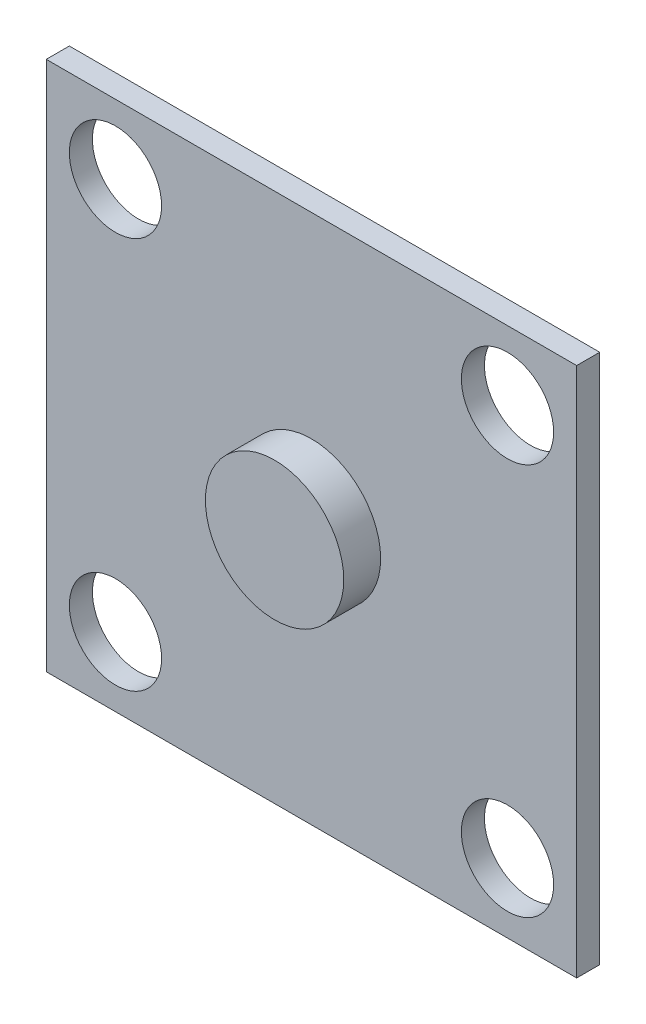
ISO-10303-21;
HEADER;
FILE_DESCRIPTION(('STEP AP214'),'2;1');
FILE_NAME('part.step','',(''),(''),'','','');
FILE_SCHEMA(('AUTOMOTIVE_DESIGN { 1 0 10303 214 1 1 1 1 }'));
ENDSEC;
DATA;
#1=APPLICATION_CONTEXT('core data for automotive mechanical design processes');
#2=APPLICATION_PROTOCOL_DEFINITION('international standard','automotive_design',2000,#1);
#3=PRODUCT_CONTEXT('',#1,'mechanical');
#4=PRODUCT('Part','Part','',(#3));
#5=PRODUCT_RELATED_PRODUCT_CATEGORY('part','',(#4));
#6=PRODUCT_DEFINITION_FORMATION('','',#4);
#7=PRODUCT_DEFINITION_CONTEXT('part definition',#1,'design');
#8=PRODUCT_DEFINITION('design','',#6,#7);
#9=PRODUCT_DEFINITION_SHAPE('','',#8);
#10=(LENGTH_UNIT() NAMED_UNIT(*) SI_UNIT(.MILLI.,.METRE.));
#11=(NAMED_UNIT(*) PLANE_ANGLE_UNIT() SI_UNIT($,.RADIAN.));
#12=(NAMED_UNIT(*) SI_UNIT($,.STERADIAN.) SOLID_ANGLE_UNIT());
#13=UNCERTAINTY_MEASURE_WITH_UNIT(LENGTH_MEASURE(1.E-05),#10,'distance_accuracy_value','');
#14=(GEOMETRIC_REPRESENTATION_CONTEXT(3) GLOBAL_UNCERTAINTY_ASSIGNED_CONTEXT((#13)) GLOBAL_UNIT_ASSIGNED_CONTEXT((#10,
#11,#12)) REPRESENTATION_CONTEXT('',''));
#15=CARTESIAN_POINT('',(0.,0.,0.));
#16=DIRECTION('',(0.,0.,1.));
#17=DIRECTION('',(1.,0.,0.));
#18=AXIS2_PLACEMENT_3D('',#15,#16,#17);
#19=CARTESIAN_POINT('',(0.,0.,1.));
#20=DIRECTION('',(0.,0.,1.));
#21=DIRECTION('',(1.,0.,0.));
#22=AXIS2_PLACEMENT_3D('',#19,#20,#21);
#23=PLANE('',#22);
#24=CARTESIAN_POINT('',(-3.27604166666667,5.62239583333333,1.));
#25=DIRECTION('',(0.,0.,1.));
#26=DIRECTION('',(1.,0.,0.));
#27=AXIS2_PLACEMENT_3D('',#24,#25,#26);
#28=CIRCLE('',#27,3.);
#29=CARTESIAN_POINT('',(-0.276041666666671,5.62239583333333,1.));
#30=VERTEX_POINT('',#29);
#31=EDGE_CURVE('E139',#30,#30,#28,.T.);
#32=ORIENTED_EDGE('',*,*,#31,.F.);
#33=EDGE_LOOP('',(#32));
#34=FACE_BOUND('',#33,.T.);
#35=CARTESIAN_POINT('',(5.22395833333333,-2.87760416666667,1.));
#36=DIRECTION('',(0.,0.,1.));
#37=DIRECTION('',(1.,0.,0.));
#38=AXIS2_PLACEMENT_3D('',#35,#36,#37);
#39=CIRCLE('',#38,2.);
#40=CARTESIAN_POINT('',(7.22395833333333,-2.87760416666667,1.));
#41=VERTEX_POINT('',#40);
#42=EDGE_CURVE('E124',#41,#41,#39,.T.);
#43=ORIENTED_EDGE('',*,*,#42,.F.);
#44=EDGE_LOOP('',(#43));
#45=FACE_BOUND('',#44,.T.);
#46=CARTESIAN_POINT('',(-11.7760416666667,14.1223958333333,1.));
#47=DIRECTION('',(0.,0.,1.));
#48=DIRECTION('',(1.,0.,0.));
#49=AXIS2_PLACEMENT_3D('',#46,#47,#48);
#50=CIRCLE('',#49,2.);
#51=CARTESIAN_POINT('',(-9.77604166666667,14.1223958333333,1.));
#52=VERTEX_POINT('',#51);
#53=EDGE_CURVE('E103',#52,#52,#50,.T.);
#54=ORIENTED_EDGE('',*,*,#53,.F.);
#55=EDGE_LOOP('',(#54));
#56=FACE_BOUND('',#55,.T.);
#57=DIRECTION('',(0.,1.,0.));
#58=VECTOR('',#57,1.);
#59=CARTESIAN_POINT('',(8.22395833333333,17.1223958333333,1.));
#60=LINE('',#59,#58);
#61=CARTESIAN_POINT('',(8.22395833333333,-5.87760416666667,1.));
#62=VERTEX_POINT('',#61);
#63=CARTESIAN_POINT('',(8.22395833333333,17.1223958333333,1.));
#64=VERTEX_POINT('',#63);
#65=EDGE_CURVE('E88',#62,#64,#60,.T.);
#66=ORIENTED_EDGE('',*,*,#65,.T.);
#67=DIRECTION('',(-1.,0.,0.));
#68=VECTOR('',#67,1.);
#69=CARTESIAN_POINT('',(-14.7760416666667,17.1223958333333,1.));
#70=LINE('',#69,#68);
#71=CARTESIAN_POINT('',(-14.7760416666667,17.1223958333333,1.));
#72=VERTEX_POINT('',#71);
#73=EDGE_CURVE('E83',#64,#72,#70,.T.);
#74=ORIENTED_EDGE('',*,*,#73,.T.);
#75=DIRECTION('',(0.,-1.,0.));
#76=VECTOR('',#75,1.);
#77=CARTESIAN_POINT('',(-14.7760416666667,17.1223958333333,1.));
#78=LINE('',#77,#76);
#79=CARTESIAN_POINT('',(-14.7760416666667,-5.87760416666667,1.));
#80=VERTEX_POINT('',#79);
#81=EDGE_CURVE('E86',#72,#80,#78,.T.);
#82=ORIENTED_EDGE('',*,*,#81,.T.);
#83=DIRECTION('',(1.,0.,0.));
#84=VECTOR('',#83,1.);
#85=CARTESIAN_POINT('',(-14.7760416666667,-5.87760416666667,1.));
#86=LINE('',#85,#84);
#87=EDGE_CURVE('E53',#80,#62,#86,.T.);
#88=ORIENTED_EDGE('',*,*,#87,.T.);
#89=EDGE_LOOP('',(#66,#74,#82,#88));
#90=FACE_BOUND('',#89,.T.);
#91=CARTESIAN_POINT('',(-11.7760416666667,-2.87760416666667,1.));
#92=DIRECTION('',(0.,0.,1.));
#93=DIRECTION('',(1.,0.,0.));
#94=AXIS2_PLACEMENT_3D('',#91,#92,#93);
#95=CIRCLE('',#94,2.);
#96=CARTESIAN_POINT('',(-9.77604166666667,-2.87760416666667,1.));
#97=VERTEX_POINT('',#96);
#98=EDGE_CURVE('E118',#97,#97,#95,.T.);
#99=ORIENTED_EDGE('',*,*,#98,.F.);
#100=EDGE_LOOP('',(#99));
#101=FACE_BOUND('',#100,.T.);
#102=CARTESIAN_POINT('',(5.22395833333333,14.1223958333333,1.));
#103=DIRECTION('',(0.,0.,1.));
#104=DIRECTION('',(1.,0.,0.));
#105=AXIS2_PLACEMENT_3D('',#102,#103,#104);
#106=CIRCLE('',#105,2.);
#107=CARTESIAN_POINT('',(7.22395833333333,14.1223958333333,1.));
#108=VERTEX_POINT('',#107);
#109=EDGE_CURVE('E130',#108,#108,#106,.T.);
#110=ORIENTED_EDGE('',*,*,#109,.F.);
#111=EDGE_LOOP('',(#110));
#112=FACE_BOUND('',#111,.T.);
#113=ADVANCED_FACE('F36',(#34,#45,#56,#90,#101,#112),#23,.T.);
#114=CARTESIAN_POINT('',(0.,0.,0.));
#115=DIRECTION('',(0.,0.,1.));
#116=DIRECTION('',(1.,0.,0.));
#117=AXIS2_PLACEMENT_3D('',#114,#115,#116);
#118=PLANE('',#117);
#119=DIRECTION('',(0.,1.,0.));
#120=VECTOR('',#119,1.);
#121=CARTESIAN_POINT('',(8.22395833333333,17.1223958333333,0.));
#122=LINE('',#121,#120);
#123=CARTESIAN_POINT('',(8.22395833333333,-5.87760416666667,0.));
#124=VERTEX_POINT('',#123);
#125=CARTESIAN_POINT('',(8.22395833333333,17.1223958333333,0.));
#126=VERTEX_POINT('',#125);
#127=EDGE_CURVE('E100',#124,#126,#122,.T.);
#128=ORIENTED_EDGE('',*,*,#127,.F.);
#129=DIRECTION('',(1.,0.,0.));
#130=VECTOR('',#129,1.);
#131=CARTESIAN_POINT('',(-14.7760416666667,-5.87760416666667,0.));
#132=LINE('',#131,#130);
#133=CARTESIAN_POINT('',(-14.7760416666667,-5.87760416666667,0.));
#134=VERTEX_POINT('',#133);
#135=EDGE_CURVE('E76',#134,#124,#132,.T.);
#136=ORIENTED_EDGE('',*,*,#135,.F.);
#137=DIRECTION('',(0.,-1.,0.));
#138=VECTOR('',#137,1.);
#139=CARTESIAN_POINT('',(-14.7760416666667,17.1223958333333,0.));
#140=LINE('',#139,#138);
#141=CARTESIAN_POINT('',(-14.7760416666667,17.1223958333333,0.));
#142=VERTEX_POINT('',#141);
#143=EDGE_CURVE('E70',#142,#134,#140,.T.);
#144=ORIENTED_EDGE('',*,*,#143,.F.);
#145=DIRECTION('',(-1.,0.,0.));
#146=VECTOR('',#145,1.);
#147=CARTESIAN_POINT('',(-14.7760416666667,17.1223958333333,0.));
#148=LINE('',#147,#146);
#149=EDGE_CURVE('E92',#126,#142,#148,.T.);
#150=ORIENTED_EDGE('',*,*,#149,.F.);
#151=EDGE_LOOP('',(#128,#136,#144,#150));
#152=FACE_BOUND('',#151,.T.);
#153=CARTESIAN_POINT('',(-11.7760416666667,14.1223958333333,0.));
#154=DIRECTION('',(0.,0.,1.));
#155=DIRECTION('',(1.,0.,0.));
#156=AXIS2_PLACEMENT_3D('',#153,#154,#155);
#157=CIRCLE('',#156,2.);
#158=CARTESIAN_POINT('',(-9.77604166666667,14.1223958333333,0.));
#159=VERTEX_POINT('',#158);
#160=EDGE_CURVE('E115',#159,#159,#157,.T.);
#161=ORIENTED_EDGE('',*,*,#160,.T.);
#162=EDGE_LOOP('',(#161));
#163=FACE_BOUND('',#162,.T.);
#164=CARTESIAN_POINT('',(-11.7760416666667,-2.87760416666667,0.));
#165=DIRECTION('',(0.,0.,1.));
#166=DIRECTION('',(1.,0.,0.));
#167=AXIS2_PLACEMENT_3D('',#164,#165,#166);
#168=CIRCLE('',#167,2.);
#169=CARTESIAN_POINT('',(-9.77604166666667,-2.87760416666667,0.));
#170=VERTEX_POINT('',#169);
#171=EDGE_CURVE('E121',#170,#170,#168,.T.);
#172=ORIENTED_EDGE('',*,*,#171,.T.);
#173=EDGE_LOOP('',(#172));
#174=FACE_BOUND('',#173,.T.);
#175=CARTESIAN_POINT('',(5.22395833333333,-2.87760416666667,0.));
#176=DIRECTION('',(0.,0.,1.));
#177=DIRECTION('',(1.,0.,0.));
#178=AXIS2_PLACEMENT_3D('',#175,#176,#177);
#179=CIRCLE('',#178,2.);
#180=CARTESIAN_POINT('',(7.22395833333333,-2.87760416666667,0.));
#181=VERTEX_POINT('',#180);
#182=EDGE_CURVE('E127',#181,#181,#179,.T.);
#183=ORIENTED_EDGE('',*,*,#182,.T.);
#184=EDGE_LOOP('',(#183));
#185=FACE_BOUND('',#184,.T.);
#186=CARTESIAN_POINT('',(5.22395833333333,14.1223958333333,0.));
#187=DIRECTION('',(0.,0.,1.));
#188=DIRECTION('',(1.,0.,0.));
#189=AXIS2_PLACEMENT_3D('',#186,#187,#188);
#190=CIRCLE('',#189,2.);
#191=CARTESIAN_POINT('',(7.22395833333333,14.1223958333333,0.));
#192=VERTEX_POINT('',#191);
#193=EDGE_CURVE('E133',#192,#192,#190,.T.);
#194=ORIENTED_EDGE('',*,*,#193,.T.);
#195=EDGE_LOOP('',(#194));
#196=FACE_BOUND('',#195,.T.);
#197=ADVANCED_FACE('F111',(#152,#163,#174,#185,#196),#118,.F.);
#198=CARTESIAN_POINT('',(8.22395833333333,17.1223958333333,1.));
#199=DIRECTION('',(-1.,0.,0.));
#200=DIRECTION('',(0.,-1.,0.));
#201=AXIS2_PLACEMENT_3D('',#198,#199,#200);
#202=PLANE('',#201);
#203=ORIENTED_EDGE('',*,*,#127,.T.);
#204=DIRECTION('',(0.,0.,-1.));
#205=VECTOR('',#204,1.);
#206=CARTESIAN_POINT('',(8.22395833333333,17.1223958333333,1.));
#207=LINE('',#206,#205);
#208=EDGE_CURVE('E11',#64,#126,#207,.T.);
#209=ORIENTED_EDGE('',*,*,#208,.F.);
#210=ORIENTED_EDGE('',*,*,#65,.F.);
#211=DIRECTION('',(0.,0.,-1.));
#212=VECTOR('',#211,1.);
#213=CARTESIAN_POINT('',(8.22395833333333,-5.87760416666667,1.));
#214=LINE('',#213,#212);
#215=EDGE_CURVE('E96',#62,#124,#214,.T.);
#216=ORIENTED_EDGE('',*,*,#215,.T.);
#217=EDGE_LOOP('',(#203,#209,#210,#216));
#218=FACE_BOUND('',#217,.T.);
#219=ADVANCED_FACE('F38',(#218),#202,.F.);
#220=CARTESIAN_POINT('',(-14.7760416666667,17.1223958333333,1.));
#221=DIRECTION('',(0.,-1.,0.));
#222=DIRECTION('',(0.,0.,-1.));
#223=AXIS2_PLACEMENT_3D('',#220,#221,#222);
#224=PLANE('',#223);
#225=ORIENTED_EDGE('',*,*,#149,.T.);
#226=DIRECTION('',(0.,0.,-1.));
#227=VECTOR('',#226,1.);
#228=CARTESIAN_POINT('',(-14.7760416666667,17.1223958333333,1.));
#229=LINE('',#228,#227);
#230=EDGE_CURVE('E45',#72,#142,#229,.T.);
#231=ORIENTED_EDGE('',*,*,#230,.F.);
#232=ORIENTED_EDGE('',*,*,#73,.F.);
#233=ORIENTED_EDGE('',*,*,#208,.T.);
#234=EDGE_LOOP('',(#225,#231,#232,#233));
#235=FACE_BOUND('',#234,.T.);
#236=ADVANCED_FACE('F91',(#235),#224,.F.);
#237=CARTESIAN_POINT('',(-14.7760416666667,17.1223958333333,1.));
#238=DIRECTION('',(1.,0.,0.));
#239=DIRECTION('',(0.,1.,0.));
#240=AXIS2_PLACEMENT_3D('',#237,#238,#239);
#241=PLANE('',#240);
#242=ORIENTED_EDGE('',*,*,#143,.T.);
#243=DIRECTION('',(0.,0.,-1.));
#244=VECTOR('',#243,1.);
#245=CARTESIAN_POINT('',(-14.7760416666667,-5.87760416666667,1.));
#246=LINE('',#245,#244);
#247=EDGE_CURVE('E93',#80,#134,#246,.T.);
#248=ORIENTED_EDGE('',*,*,#247,.F.);
#249=ORIENTED_EDGE('',*,*,#81,.F.);
#250=ORIENTED_EDGE('',*,*,#230,.T.);
#251=EDGE_LOOP('',(#242,#248,#249,#250));
#252=FACE_BOUND('',#251,.T.);
#253=ADVANCED_FACE('F94',(#252),#241,.F.);
#254=CARTESIAN_POINT('',(-14.7760416666667,-5.87760416666667,1.));
#255=DIRECTION('',(0.,1.,0.));
#256=DIRECTION('',(-1.,0.,0.));
#257=AXIS2_PLACEMENT_3D('',#254,#255,#256);
#258=PLANE('',#257);
#259=ORIENTED_EDGE('',*,*,#135,.T.);
#260=ORIENTED_EDGE('',*,*,#215,.F.);
#261=ORIENTED_EDGE('',*,*,#87,.F.);
#262=ORIENTED_EDGE('',*,*,#247,.T.);
#263=EDGE_LOOP('',(#259,#260,#261,#262));
#264=FACE_BOUND('',#263,.T.);
#265=ADVANCED_FACE('F108',(#264),#258,.F.);
#266=CARTESIAN_POINT('',(-11.7760416666667,14.1223958333333,1.));
#267=DIRECTION('',(0.,0.,-1.));
#268=DIRECTION('',(-1.,0.,0.));
#269=AXIS2_PLACEMENT_3D('',#266,#267,#268);
#270=CYLINDRICAL_SURFACE('',#269,2.);
#271=ORIENTED_EDGE('',*,*,#53,.T.);
#272=EDGE_LOOP('',(#271));
#273=FACE_BOUND('',#272,.T.);
#274=ORIENTED_EDGE('',*,*,#160,.F.);
#275=EDGE_LOOP('',(#274));
#276=FACE_BOUND('',#275,.T.);
#277=ADVANCED_FACE('F161',(#273,#276),#270,.F.);
#278=CARTESIAN_POINT('',(-11.7760416666667,-2.87760416666667,1.));
#279=DIRECTION('',(0.,0.,-1.));
#280=DIRECTION('',(-1.,0.,0.));
#281=AXIS2_PLACEMENT_3D('',#278,#279,#280);
#282=CYLINDRICAL_SURFACE('',#281,2.);
#283=ORIENTED_EDGE('',*,*,#98,.T.);
#284=EDGE_LOOP('',(#283));
#285=FACE_BOUND('',#284,.T.);
#286=ORIENTED_EDGE('',*,*,#171,.F.);
#287=EDGE_LOOP('',(#286));
#288=FACE_BOUND('',#287,.T.);
#289=ADVANCED_FACE('F164',(#285,#288),#282,.F.);
#290=CARTESIAN_POINT('',(5.22395833333333,-2.87760416666667,1.));
#291=DIRECTION('',(0.,0.,-1.));
#292=DIRECTION('',(-1.,0.,0.));
#293=AXIS2_PLACEMENT_3D('',#290,#291,#292);
#294=CYLINDRICAL_SURFACE('',#293,2.);
#295=ORIENTED_EDGE('',*,*,#42,.T.);
#296=EDGE_LOOP('',(#295));
#297=FACE_BOUND('',#296,.T.);
#298=ORIENTED_EDGE('',*,*,#182,.F.);
#299=EDGE_LOOP('',(#298));
#300=FACE_BOUND('',#299,.T.);
#301=ADVANCED_FACE('F177',(#297,#300),#294,.F.);
#302=CARTESIAN_POINT('',(5.22395833333333,14.1223958333333,1.));
#303=DIRECTION('',(0.,0.,-1.));
#304=DIRECTION('',(-1.,0.,0.));
#305=AXIS2_PLACEMENT_3D('',#302,#303,#304);
#306=CYLINDRICAL_SURFACE('',#305,2.);
#307=ORIENTED_EDGE('',*,*,#109,.T.);
#308=EDGE_LOOP('',(#307));
#309=FACE_BOUND('',#308,.T.);
#310=ORIENTED_EDGE('',*,*,#193,.F.);
#311=EDGE_LOOP('',(#310));
#312=FACE_BOUND('',#311,.T.);
#313=ADVANCED_FACE('F150',(#309,#312),#306,.F.);
#314=CARTESIAN_POINT('',(-3.27604166666667,5.62239583333333,2.6));
#315=DIRECTION('',(0.,0.,-1.));
#316=DIRECTION('',(-1.,0.,0.));
#317=AXIS2_PLACEMENT_3D('',#314,#315,#316);
#318=CYLINDRICAL_SURFACE('',#317,3.);
#319=CARTESIAN_POINT('',(-3.27604166666667,5.62239583333333,2.6));
#320=DIRECTION('',(0.,0.,1.));
#321=DIRECTION('',(1.,0.,0.));
#322=AXIS2_PLACEMENT_3D('',#319,#320,#321);
#323=CIRCLE('',#322,3.);
#324=CARTESIAN_POINT('',(-0.276041666666671,5.62239583333333,2.6));
#325=VERTEX_POINT('',#324);
#326=EDGE_CURVE('E136',#325,#325,#323,.T.);
#327=ORIENTED_EDGE('',*,*,#326,.F.);
#328=EDGE_LOOP('',(#327));
#329=FACE_BOUND('',#328,.T.);
#330=ORIENTED_EDGE('',*,*,#31,.T.);
#331=EDGE_LOOP('',(#330));
#332=FACE_BOUND('',#331,.T.);
#333=ADVANCED_FACE('F147',(#329,#332),#318,.T.);
#334=CARTESIAN_POINT('',(-3.27604166666667,5.62239583333333,2.6));
#335=DIRECTION('',(0.,0.,1.));
#336=DIRECTION('',(1.,0.,0.));
#337=AXIS2_PLACEMENT_3D('',#334,#335,#336);
#338=PLANE('',#337);
#339=ORIENTED_EDGE('',*,*,#326,.T.);
#340=EDGE_LOOP('',(#339));
#341=FACE_BOUND('',#340,.T.);
#342=ADVANCED_FACE('F145',(#341),#338,.T.);
#343=CLOSED_SHELL('',(#113,#197,#219,#236,#253,#265,#277,#289,#301,#313,#333,#342));
#344=MANIFOLD_SOLID_BREP('B2',#343);
#345=ADVANCED_BREP_SHAPE_REPRESENTATION('',(#18,#344),#14);
#346=SHAPE_DEFINITION_REPRESENTATION(#9,#345);
ENDSEC;
END-ISO-10303-21;
